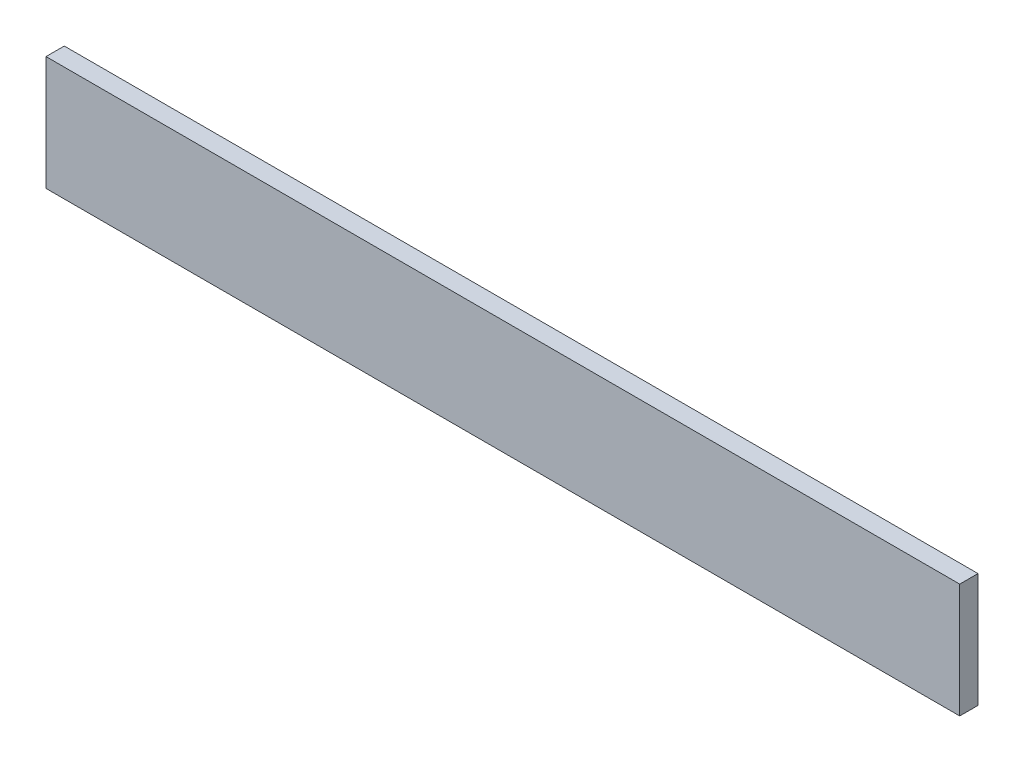
ISO-10303-21;
HEADER;
FILE_DESCRIPTION(('STEP AP214'),'2;1');
FILE_NAME('part.step','',(''),(''),'','','');
FILE_SCHEMA(('AUTOMOTIVE_DESIGN { 1 0 10303 214 1 1 1 1 }'));
ENDSEC;
DATA;
#1=APPLICATION_CONTEXT('core data for automotive mechanical design processes');
#2=APPLICATION_PROTOCOL_DEFINITION('international standard','automotive_design',2000,#1);
#3=PRODUCT_CONTEXT('',#1,'mechanical');
#4=PRODUCT('Part','Part','',(#3));
#5=PRODUCT_RELATED_PRODUCT_CATEGORY('part','',(#4));
#6=PRODUCT_DEFINITION_FORMATION('','',#4);
#7=PRODUCT_DEFINITION_CONTEXT('part definition',#1,'design');
#8=PRODUCT_DEFINITION('design','',#6,#7);
#9=PRODUCT_DEFINITION_SHAPE('','',#8);
#10=(LENGTH_UNIT() NAMED_UNIT(*) SI_UNIT(.MILLI.,.METRE.));
#11=(NAMED_UNIT(*) PLANE_ANGLE_UNIT() SI_UNIT($,.RADIAN.));
#12=(NAMED_UNIT(*) SI_UNIT($,.STERADIAN.) SOLID_ANGLE_UNIT());
#13=UNCERTAINTY_MEASURE_WITH_UNIT(LENGTH_MEASURE(1.E-05),#10,'distance_accuracy_value','');
#14=(GEOMETRIC_REPRESENTATION_CONTEXT(3) GLOBAL_UNCERTAINTY_ASSIGNED_CONTEXT((#13)) GLOBAL_UNIT_ASSIGNED_CONTEXT((#10,
#11,#12)) REPRESENTATION_CONTEXT('',''));
#15=CARTESIAN_POINT('',(0.,0.,0.));
#16=DIRECTION('',(0.,0.,1.));
#17=DIRECTION('',(1.,0.,0.));
#18=AXIS2_PLACEMENT_3D('',#15,#16,#17);
#19=CARTESIAN_POINT('',(0.,0.,6.8));
#20=DIRECTION('',(1.,0.,0.));
#21=DIRECTION('',(0.,0.,-1.));
#22=AXIS2_PLACEMENT_3D('',#19,#20,#21);
#23=PLANE('',#22);
#24=DIRECTION('',(0.,1.,0.));
#25=VECTOR('',#24,1.);
#26=CARTESIAN_POINT('',(0.,0.,10.));
#27=LINE('',#26,#25);
#28=CARTESIAN_POINT('',(0.,-20.,10.));
#29=VERTEX_POINT('',#28);
#30=CARTESIAN_POINT('',(0.,0.,10.));
#31=VERTEX_POINT('',#30);
#32=EDGE_CURVE('E99',#29,#31,#27,.T.);
#33=ORIENTED_EDGE('',*,*,#32,.T.);
#34=DIRECTION('',(0.,0.,1.));
#35=VECTOR('',#34,1.);
#36=CARTESIAN_POINT('',(0.,0.,6.8));
#37=LINE('',#36,#35);
#38=CARTESIAN_POINT('',(0.,0.,6.8));
#39=VERTEX_POINT('',#38);
#40=EDGE_CURVE('E11',#39,#31,#37,.T.);
#41=ORIENTED_EDGE('',*,*,#40,.F.);
#42=DIRECTION('',(0.,1.,0.));
#43=VECTOR('',#42,1.);
#44=CARTESIAN_POINT('',(0.,0.,6.8));
#45=LINE('',#44,#43);
#46=CARTESIAN_POINT('',(0.,-20.,6.8));
#47=VERTEX_POINT('',#46);
#48=EDGE_CURVE('E87',#47,#39,#45,.T.);
#49=ORIENTED_EDGE('',*,*,#48,.F.);
#50=DIRECTION('',(0.,0.,1.));
#51=VECTOR('',#50,1.);
#52=CARTESIAN_POINT('',(0.,-20.,6.8));
#53=LINE('',#52,#51);
#54=EDGE_CURVE('E95',#47,#29,#53,.T.);
#55=ORIENTED_EDGE('',*,*,#54,.T.);
#56=EDGE_LOOP('',(#33,#41,#49,#55));
#57=FACE_BOUND('',#56,.T.);
#58=ADVANCED_FACE('F36',(#57),#23,.F.);
#59=CARTESIAN_POINT('',(0.,0.,6.8));
#60=DIRECTION('',(0.,-1.,0.));
#61=DIRECTION('',(0.,0.,-1.));
#62=AXIS2_PLACEMENT_3D('',#59,#60,#61);
#63=PLANE('',#62);
#64=DIRECTION('',(1.,0.,0.));
#65=VECTOR('',#64,1.);
#66=CARTESIAN_POINT('',(0.,0.,10.));
#67=LINE('',#66,#65);
#68=CARTESIAN_POINT('',(160.,0.,10.));
#69=VERTEX_POINT('',#68);
#70=EDGE_CURVE('E91',#31,#69,#67,.T.);
#71=ORIENTED_EDGE('',*,*,#70,.T.);
#72=DIRECTION('',(0.,0.,1.));
#73=VECTOR('',#72,1.);
#74=CARTESIAN_POINT('',(160.,0.,6.8));
#75=LINE('',#74,#73);
#76=CARTESIAN_POINT('',(160.,0.,6.8));
#77=VERTEX_POINT('',#76);
#78=EDGE_CURVE('E44',#77,#69,#75,.T.);
#79=ORIENTED_EDGE('',*,*,#78,.F.);
#80=DIRECTION('',(1.,0.,0.));
#81=VECTOR('',#80,1.);
#82=CARTESIAN_POINT('',(0.,0.,6.8));
#83=LINE('',#82,#81);
#84=EDGE_CURVE('E82',#39,#77,#83,.T.);
#85=ORIENTED_EDGE('',*,*,#84,.F.);
#86=ORIENTED_EDGE('',*,*,#40,.T.);
#87=EDGE_LOOP('',(#71,#79,#85,#86));
#88=FACE_BOUND('',#87,.T.);
#89=ADVANCED_FACE('F90',(#88),#63,.F.);
#90=CARTESIAN_POINT('',(160.,0.,6.8));
#91=DIRECTION('',(-1.,0.,0.));
#92=DIRECTION('',(0.,0.,1.));
#93=AXIS2_PLACEMENT_3D('',#90,#91,#92);
#94=PLANE('',#93);
#95=DIRECTION('',(0.,-1.,0.));
#96=VECTOR('',#95,1.);
#97=CARTESIAN_POINT('',(160.,0.,10.));
#98=LINE('',#97,#96);
#99=CARTESIAN_POINT('',(160.,-20.,10.));
#100=VERTEX_POINT('',#99);
#101=EDGE_CURVE('E69',#69,#100,#98,.T.);
#102=ORIENTED_EDGE('',*,*,#101,.T.);
#103=DIRECTION('',(0.,0.,1.));
#104=VECTOR('',#103,1.);
#105=CARTESIAN_POINT('',(160.,-20.,6.8));
#106=LINE('',#105,#104);
#107=CARTESIAN_POINT('',(160.,-20.,6.8));
#108=VERTEX_POINT('',#107);
#109=EDGE_CURVE('E92',#108,#100,#106,.T.);
#110=ORIENTED_EDGE('',*,*,#109,.F.);
#111=DIRECTION('',(0.,-1.,0.));
#112=VECTOR('',#111,1.);
#113=CARTESIAN_POINT('',(160.,0.,6.8));
#114=LINE('',#113,#112);
#115=EDGE_CURVE('E85',#77,#108,#114,.T.);
#116=ORIENTED_EDGE('',*,*,#115,.F.);
#117=ORIENTED_EDGE('',*,*,#78,.T.);
#118=EDGE_LOOP('',(#102,#110,#116,#117));
#119=FACE_BOUND('',#118,.T.);
#120=ADVANCED_FACE('F93',(#119),#94,.F.);
#121=CARTESIAN_POINT('',(0.,-20.,6.8));
#122=DIRECTION('',(0.,1.,0.));
#123=DIRECTION('',(0.,0.,1.));
#124=AXIS2_PLACEMENT_3D('',#121,#122,#123);
#125=PLANE('',#124);
#126=DIRECTION('',(-1.,0.,0.));
#127=VECTOR('',#126,1.);
#128=CARTESIAN_POINT('',(0.,-20.,10.));
#129=LINE('',#128,#127);
#130=EDGE_CURVE('E75',#100,#29,#129,.T.);
#131=ORIENTED_EDGE('',*,*,#130,.T.);
#132=ORIENTED_EDGE('',*,*,#54,.F.);
#133=DIRECTION('',(-1.,0.,0.));
#134=VECTOR('',#133,1.);
#135=CARTESIAN_POINT('',(0.,-20.,6.8));
#136=LINE('',#135,#134);
#137=EDGE_CURVE('E52',#108,#47,#136,.T.);
#138=ORIENTED_EDGE('',*,*,#137,.F.);
#139=ORIENTED_EDGE('',*,*,#109,.T.);
#140=EDGE_LOOP('',(#131,#132,#138,#139));
#141=FACE_BOUND('',#140,.T.);
#142=ADVANCED_FACE('F106',(#141),#125,.F.);
#143=CARTESIAN_POINT('',(0.,0.,6.8));
#144=DIRECTION('',(0.,0.,1.));
#145=DIRECTION('',(1.,0.,0.));
#146=AXIS2_PLACEMENT_3D('',#143,#144,#145);
#147=PLANE('',#146);
#148=ORIENTED_EDGE('',*,*,#48,.T.);
#149=ORIENTED_EDGE('',*,*,#84,.T.);
#150=ORIENTED_EDGE('',*,*,#115,.T.);
#151=ORIENTED_EDGE('',*,*,#137,.T.);
#152=EDGE_LOOP('',(#148,#149,#150,#151));
#153=FACE_BOUND('',#152,.T.);
#154=ADVANCED_FACE('F83',(#153),#147,.F.);
#155=CARTESIAN_POINT('',(0.,0.,10.));
#156=DIRECTION('',(0.,0.,1.));
#157=DIRECTION('',(1.,0.,0.));
#158=AXIS2_PLACEMENT_3D('',#155,#156,#157);
#159=PLANE('',#158);
#160=ORIENTED_EDGE('',*,*,#32,.F.);
#161=ORIENTED_EDGE('',*,*,#130,.F.);
#162=ORIENTED_EDGE('',*,*,#101,.F.);
#163=ORIENTED_EDGE('',*,*,#70,.F.);
#164=EDGE_LOOP('',(#160,#161,#162,#163));
#165=FACE_BOUND('',#164,.T.);
#166=ADVANCED_FACE('F109',(#165),#159,.T.);
#167=CLOSED_SHELL('',(#58,#89,#120,#142,#154,#166));
#168=MANIFOLD_SOLID_BREP('B2',#167);
#169=ADVANCED_BREP_SHAPE_REPRESENTATION('',(#18,#168),#14);
#170=SHAPE_DEFINITION_REPRESENTATION(#9,#169);
ENDSEC;
END-ISO-10303-21;
